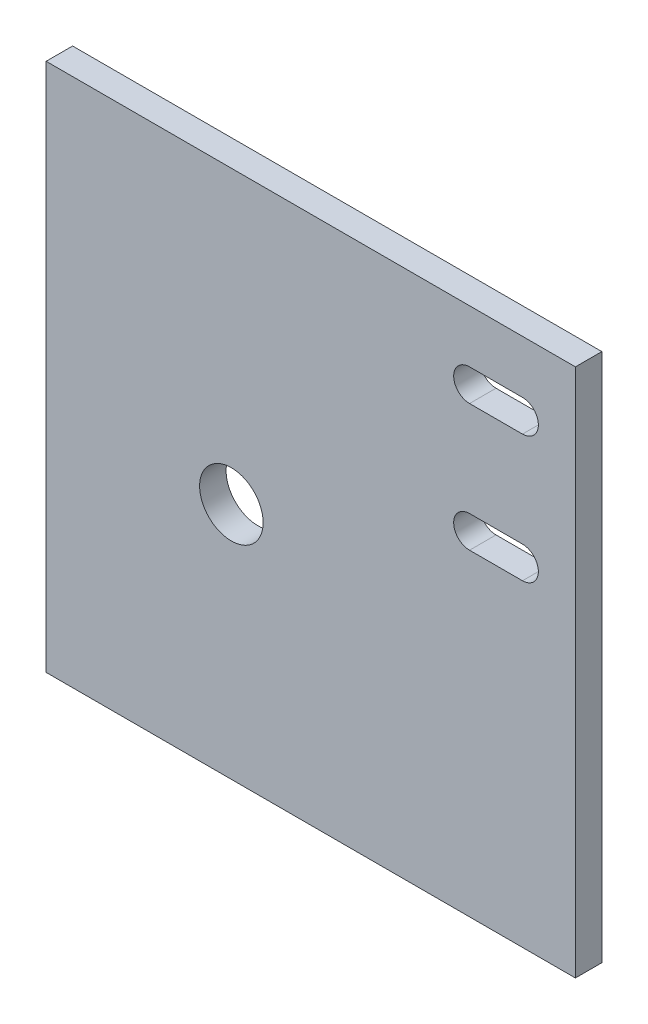
ISO-10303-21;
HEADER;
FILE_DESCRIPTION(('STEP AP214'),'2;1');
FILE_NAME('part.step','',(''),(''),'','','');
FILE_SCHEMA(('AUTOMOTIVE_DESIGN { 1 0 10303 214 1 1 1 1 }'));
ENDSEC;
DATA;
#1=APPLICATION_CONTEXT('core data for automotive mechanical design processes');
#2=APPLICATION_PROTOCOL_DEFINITION('international standard','automotive_design',2000,#1);
#3=PRODUCT_CONTEXT('',#1,'mechanical');
#4=PRODUCT('Part','Part','',(#3));
#5=PRODUCT_RELATED_PRODUCT_CATEGORY('part','',(#4));
#6=PRODUCT_DEFINITION_FORMATION('','',#4);
#7=PRODUCT_DEFINITION_CONTEXT('part definition',#1,'design');
#8=PRODUCT_DEFINITION('design','',#6,#7);
#9=PRODUCT_DEFINITION_SHAPE('','',#8);
#10=(LENGTH_UNIT() NAMED_UNIT(*) SI_UNIT(.MILLI.,.METRE.));
#11=(NAMED_UNIT(*) PLANE_ANGLE_UNIT() SI_UNIT($,.RADIAN.));
#12=(NAMED_UNIT(*) SI_UNIT($,.STERADIAN.) SOLID_ANGLE_UNIT());
#13=UNCERTAINTY_MEASURE_WITH_UNIT(LENGTH_MEASURE(1.E-05),#10,'distance_accuracy_value','');
#14=(GEOMETRIC_REPRESENTATION_CONTEXT(3) GLOBAL_UNCERTAINTY_ASSIGNED_CONTEXT((#13)) GLOBAL_UNIT_ASSIGNED_CONTEXT((#10,
#11,#12)) REPRESENTATION_CONTEXT('',''));
#15=CARTESIAN_POINT('',(0.,0.,0.));
#16=DIRECTION('',(0.,0.,1.));
#17=DIRECTION('',(1.,0.,0.));
#18=AXIS2_PLACEMENT_3D('',#15,#16,#17);
#19=CARTESIAN_POINT('',(0.,0.,5.));
#20=DIRECTION('',(0.,0.,1.));
#21=DIRECTION('',(1.,0.,0.));
#22=AXIS2_PLACEMENT_3D('',#19,#20,#21);
#23=PLANE('',#22);
#24=CARTESIAN_POINT('',(35.,-55.,5.));
#25=DIRECTION('',(0.,0.,1.));
#26=DIRECTION('',(1.,0.,0.));
#27=AXIS2_PLACEMENT_3D('',#24,#25,#26);
#28=CIRCLE('',#27,6.);
#29=CARTESIAN_POINT('',(41.,-55.,5.));
#30=VERTEX_POINT('',#29);
#31=EDGE_CURVE('E348',#30,#30,#28,.T.);
#32=ORIENTED_EDGE('',*,*,#31,.F.);
#33=EDGE_LOOP('',(#32));
#34=FACE_BOUND('',#33,.T.);
#35=DIRECTION('',(0.,-1.,0.));
#36=VECTOR('',#35,1.);
#37=CARTESIAN_POINT('',(0.,0.,5.));
#38=LINE('',#37,#36);
#39=CARTESIAN_POINT('',(0.,0.,5.));
#40=VERTEX_POINT('',#39);
#41=CARTESIAN_POINT('',(0.,-100.,5.));
#42=VERTEX_POINT('',#41);
#43=EDGE_CURVE('E222',#40,#42,#38,.T.);
#44=ORIENTED_EDGE('',*,*,#43,.T.);
#45=DIRECTION('',(1.,0.,0.));
#46=VECTOR('',#45,1.);
#47=CARTESIAN_POINT('',(0.,-100.,5.));
#48=LINE('',#47,#46);
#49=CARTESIAN_POINT('',(100.,-100.,5.));
#50=VERTEX_POINT('',#49);
#51=EDGE_CURVE('E226',#42,#50,#48,.T.);
#52=ORIENTED_EDGE('',*,*,#51,.T.);
#53=DIRECTION('',(0.,1.,0.));
#54=VECTOR('',#53,1.);
#55=CARTESIAN_POINT('',(100.,0.,5.));
#56=LINE('',#55,#54);
#57=CARTESIAN_POINT('',(100.,0.,5.));
#58=VERTEX_POINT('',#57);
#59=EDGE_CURVE('E230',#50,#58,#56,.T.);
#60=ORIENTED_EDGE('',*,*,#59,.T.);
#61=DIRECTION('',(-1.,0.,0.));
#62=VECTOR('',#61,1.);
#63=CARTESIAN_POINT('',(0.,0.,5.));
#64=LINE('',#63,#62);
#65=EDGE_CURVE('E233',#58,#40,#64,.T.);
#66=ORIENTED_EDGE('',*,*,#65,.T.);
#67=EDGE_LOOP('',(#44,#52,#60,#66));
#68=FACE_BOUND('',#67,.T.);
#69=DIRECTION('',(1.,0.,0.));
#70=VECTOR('',#69,1.);
#71=CARTESIAN_POINT('',(80.,-16.,5.));
#72=LINE('',#71,#70);
#73=CARTESIAN_POINT('',(80.,-16.,5.));
#74=VERTEX_POINT('',#73);
#75=CARTESIAN_POINT('',(90.,-16.,5.));
#76=VERTEX_POINT('',#75);
#77=EDGE_CURVE('E182',#74,#76,#72,.T.);
#78=ORIENTED_EDGE('',*,*,#77,.F.);
#79=CARTESIAN_POINT('',(80.,-13.,5.));
#80=DIRECTION('',(0.,0.,1.));
#81=DIRECTION('',(1.,0.,0.));
#82=AXIS2_PLACEMENT_3D('',#79,#80,#81);
#83=CIRCLE('',#82,3.);
#84=CARTESIAN_POINT('',(80.,-10.,5.));
#85=VERTEX_POINT('',#84);
#86=EDGE_CURVE('E179',#85,#74,#83,.T.);
#87=ORIENTED_EDGE('',*,*,#86,.F.);
#88=DIRECTION('',(-1.,0.,0.));
#89=VECTOR('',#88,1.);
#90=CARTESIAN_POINT('',(80.,-10.,5.));
#91=LINE('',#90,#89);
#92=CARTESIAN_POINT('',(90.,-10.,5.));
#93=VERTEX_POINT('',#92);
#94=EDGE_CURVE('E190',#93,#85,#91,.T.);
#95=ORIENTED_EDGE('',*,*,#94,.F.);
#96=CARTESIAN_POINT('',(90.,-13.,5.));
#97=DIRECTION('',(0.,0.,1.));
#98=DIRECTION('',(1.,0.,0.));
#99=AXIS2_PLACEMENT_3D('',#96,#97,#98);
#100=CIRCLE('',#99,3.);
#101=EDGE_CURVE('E186',#76,#93,#100,.T.);
#102=ORIENTED_EDGE('',*,*,#101,.F.);
#103=EDGE_LOOP('',(#78,#87,#95,#102));
#104=FACE_BOUND('',#103,.T.);
#105=DIRECTION('',(1.,0.,0.));
#106=VECTOR('',#105,1.);
#107=CARTESIAN_POINT('',(80.,-40.,5.));
#108=LINE('',#107,#106);
#109=CARTESIAN_POINT('',(80.,-40.,5.));
#110=VERTEX_POINT('',#109);
#111=CARTESIAN_POINT('',(90.,-40.,5.));
#112=VERTEX_POINT('',#111);
#113=EDGE_CURVE('E138',#110,#112,#108,.T.);
#114=ORIENTED_EDGE('',*,*,#113,.F.);
#115=CARTESIAN_POINT('',(80.,-37.,5.));
#116=DIRECTION('',(0.,0.,1.));
#117=DIRECTION('',(1.,0.,0.));
#118=AXIS2_PLACEMENT_3D('',#115,#116,#117);
#119=CIRCLE('',#118,3.);
#120=CARTESIAN_POINT('',(80.,-34.,5.));
#121=VERTEX_POINT('',#120);
#122=EDGE_CURVE('E129',#121,#110,#119,.T.);
#123=ORIENTED_EDGE('',*,*,#122,.F.);
#124=DIRECTION('',(-1.,0.,0.));
#125=VECTOR('',#124,1.);
#126=CARTESIAN_POINT('',(80.,-34.,5.));
#127=LINE('',#126,#125);
#128=CARTESIAN_POINT('',(90.,-34.,5.));
#129=VERTEX_POINT('',#128);
#130=EDGE_CURVE('E155',#129,#121,#127,.T.);
#131=ORIENTED_EDGE('',*,*,#130,.F.);
#132=CARTESIAN_POINT('',(90.,-37.,5.));
#133=DIRECTION('',(0.,0.,1.));
#134=DIRECTION('',(1.,0.,0.));
#135=AXIS2_PLACEMENT_3D('',#132,#133,#134);
#136=CIRCLE('',#135,3.);
#137=EDGE_CURVE('E151',#112,#129,#136,.T.);
#138=ORIENTED_EDGE('',*,*,#137,.F.);
#139=EDGE_LOOP('',(#114,#123,#131,#138));
#140=FACE_BOUND('',#139,.T.);
#141=ADVANCED_FACE('F39',(#34,#68,#104,#140),#23,.T.);
#142=CARTESIAN_POINT('',(0.,0.,0.));
#143=DIRECTION('',(0.,0.,1.));
#144=DIRECTION('',(1.,0.,0.));
#145=AXIS2_PLACEMENT_3D('',#142,#143,#144);
#146=PLANE('',#145);
#147=CARTESIAN_POINT('',(35.,-55.,0.));
#148=DIRECTION('',(0.,0.,1.));
#149=DIRECTION('',(1.,0.,0.));
#150=AXIS2_PLACEMENT_3D('',#147,#148,#149);
#151=CIRCLE('',#150,6.);
#152=CARTESIAN_POINT('',(41.,-55.,0.));
#153=VERTEX_POINT('',#152);
#154=EDGE_CURVE('E163',#153,#153,#151,.T.);
#155=ORIENTED_EDGE('',*,*,#154,.T.);
#156=EDGE_LOOP('',(#155));
#157=FACE_BOUND('',#156,.T.);
#158=CARTESIAN_POINT('',(80.,-13.,0.));
#159=DIRECTION('',(0.,0.,1.));
#160=DIRECTION('',(1.,0.,0.));
#161=AXIS2_PLACEMENT_3D('',#158,#159,#160);
#162=CIRCLE('',#161,3.);
#163=CARTESIAN_POINT('',(80.,-10.,0.));
#164=VERTEX_POINT('',#163);
#165=CARTESIAN_POINT('',(80.,-16.,0.));
#166=VERTEX_POINT('',#165);
#167=EDGE_CURVE('E147',#164,#166,#162,.T.);
#168=ORIENTED_EDGE('',*,*,#167,.T.);
#169=DIRECTION('',(1.,0.,0.));
#170=VECTOR('',#169,1.);
#171=CARTESIAN_POINT('',(80.,-16.,0.));
#172=LINE('',#171,#170);
#173=CARTESIAN_POINT('',(90.,-16.,0.));
#174=VERTEX_POINT('',#173);
#175=EDGE_CURVE('E197',#166,#174,#172,.T.);
#176=ORIENTED_EDGE('',*,*,#175,.T.);
#177=CARTESIAN_POINT('',(90.,-13.,0.));
#178=DIRECTION('',(0.,0.,1.));
#179=DIRECTION('',(1.,0.,0.));
#180=AXIS2_PLACEMENT_3D('',#177,#178,#179);
#181=CIRCLE('',#180,3.);
#182=CARTESIAN_POINT('',(90.,-10.,0.));
#183=VERTEX_POINT('',#182);
#184=EDGE_CURVE('E201',#174,#183,#181,.T.);
#185=ORIENTED_EDGE('',*,*,#184,.T.);
#186=DIRECTION('',(-1.,0.,0.));
#187=VECTOR('',#186,1.);
#188=CARTESIAN_POINT('',(80.,-10.,0.));
#189=LINE('',#188,#187);
#190=EDGE_CURVE('E183',#183,#164,#189,.T.);
#191=ORIENTED_EDGE('',*,*,#190,.T.);
#192=EDGE_LOOP('',(#168,#176,#185,#191));
#193=FACE_BOUND('',#192,.T.);
#194=DIRECTION('',(0.,-1.,0.));
#195=VECTOR('',#194,1.);
#196=CARTESIAN_POINT('',(0.,0.,0.));
#197=LINE('',#196,#195);
#198=CARTESIAN_POINT('',(0.,0.,0.));
#199=VERTEX_POINT('',#198);
#200=CARTESIAN_POINT('',(0.,-100.,0.));
#201=VERTEX_POINT('',#200);
#202=EDGE_CURVE('E221',#199,#201,#197,.T.);
#203=ORIENTED_EDGE('',*,*,#202,.F.);
#204=DIRECTION('',(-1.,0.,0.));
#205=VECTOR('',#204,1.);
#206=CARTESIAN_POINT('',(0.,0.,0.));
#207=LINE('',#206,#205);
#208=CARTESIAN_POINT('',(100.,0.,0.));
#209=VERTEX_POINT('',#208);
#210=EDGE_CURVE('E227',#209,#199,#207,.T.);
#211=ORIENTED_EDGE('',*,*,#210,.F.);
#212=DIRECTION('',(0.,1.,0.));
#213=VECTOR('',#212,1.);
#214=CARTESIAN_POINT('',(100.,0.,0.));
#215=LINE('',#214,#213);
#216=CARTESIAN_POINT('',(100.,-100.,0.));
#217=VERTEX_POINT('',#216);
#218=EDGE_CURVE('E243',#217,#209,#215,.T.);
#219=ORIENTED_EDGE('',*,*,#218,.F.);
#220=DIRECTION('',(1.,0.,0.));
#221=VECTOR('',#220,1.);
#222=CARTESIAN_POINT('',(0.,-100.,0.));
#223=LINE('',#222,#221);
#224=EDGE_CURVE('E240',#201,#217,#223,.T.);
#225=ORIENTED_EDGE('',*,*,#224,.F.);
#226=EDGE_LOOP('',(#203,#211,#219,#225));
#227=FACE_BOUND('',#226,.T.);
#228=CARTESIAN_POINT('',(80.,-37.,0.));
#229=DIRECTION('',(0.,0.,1.));
#230=DIRECTION('',(1.,0.,0.));
#231=AXIS2_PLACEMENT_3D('',#228,#229,#230);
#232=CIRCLE('',#231,3.);
#233=CARTESIAN_POINT('',(80.,-34.,0.));
#234=VERTEX_POINT('',#233);
#235=CARTESIAN_POINT('',(80.,-40.,0.));
#236=VERTEX_POINT('',#235);
#237=EDGE_CURVE('E63',#234,#236,#232,.T.);
#238=ORIENTED_EDGE('',*,*,#237,.T.);
#239=DIRECTION('',(1.,0.,0.));
#240=VECTOR('',#239,1.);
#241=CARTESIAN_POINT('',(80.,-40.,0.));
#242=LINE('',#241,#240);
#243=CARTESIAN_POINT('',(90.,-40.,0.));
#244=VERTEX_POINT('',#243);
#245=EDGE_CURVE('E145',#236,#244,#242,.T.);
#246=ORIENTED_EDGE('',*,*,#245,.T.);
#247=CARTESIAN_POINT('',(90.,-37.,0.));
#248=DIRECTION('',(0.,0.,1.));
#249=DIRECTION('',(1.,0.,0.));
#250=AXIS2_PLACEMENT_3D('',#247,#248,#249);
#251=CIRCLE('',#250,3.);
#252=CARTESIAN_POINT('',(90.,-34.,0.));
#253=VERTEX_POINT('',#252);
#254=EDGE_CURVE('E166',#244,#253,#251,.T.);
#255=ORIENTED_EDGE('',*,*,#254,.T.);
#256=DIRECTION('',(-1.,0.,0.));
#257=VECTOR('',#256,1.);
#258=CARTESIAN_POINT('',(80.,-34.,0.));
#259=LINE('',#258,#257);
#260=EDGE_CURVE('E139',#253,#234,#259,.T.);
#261=ORIENTED_EDGE('',*,*,#260,.T.);
#262=EDGE_LOOP('',(#238,#246,#255,#261));
#263=FACE_BOUND('',#262,.T.);
#264=ADVANCED_FACE('F266',(#157,#193,#227,#263),#146,.F.);
#265=CARTESIAN_POINT('',(0.,0.,5.));
#266=DIRECTION('',(1.,0.,0.));
#267=DIRECTION('',(0.,1.,0.));
#268=AXIS2_PLACEMENT_3D('',#265,#266,#267);
#269=PLANE('',#268);
#270=ORIENTED_EDGE('',*,*,#202,.T.);
#271=DIRECTION('',(0.,0.,-1.));
#272=VECTOR('',#271,1.);
#273=CARTESIAN_POINT('',(0.,-100.,5.));
#274=LINE('',#273,#272);
#275=EDGE_CURVE('E11',#42,#201,#274,.T.);
#276=ORIENTED_EDGE('',*,*,#275,.F.);
#277=ORIENTED_EDGE('',*,*,#43,.F.);
#278=DIRECTION('',(0.,0.,-1.));
#279=VECTOR('',#278,1.);
#280=CARTESIAN_POINT('',(0.,0.,5.));
#281=LINE('',#280,#279);
#282=EDGE_CURVE('E236',#40,#199,#281,.T.);
#283=ORIENTED_EDGE('',*,*,#282,.T.);
#284=EDGE_LOOP('',(#270,#276,#277,#283));
#285=FACE_BOUND('',#284,.T.);
#286=ADVANCED_FACE('F41',(#285),#269,.F.);
#287=CARTESIAN_POINT('',(0.,-100.,5.));
#288=DIRECTION('',(0.,1.,0.));
#289=DIRECTION('',(0.,0.,1.));
#290=AXIS2_PLACEMENT_3D('',#287,#288,#289);
#291=PLANE('',#290);
#292=ORIENTED_EDGE('',*,*,#224,.T.);
#293=DIRECTION('',(0.,0.,-1.));
#294=VECTOR('',#293,1.);
#295=CARTESIAN_POINT('',(100.,-100.,5.));
#296=LINE('',#295,#294);
#297=EDGE_CURVE('E48',#50,#217,#296,.T.);
#298=ORIENTED_EDGE('',*,*,#297,.F.);
#299=ORIENTED_EDGE('',*,*,#51,.F.);
#300=ORIENTED_EDGE('',*,*,#275,.T.);
#301=EDGE_LOOP('',(#292,#298,#299,#300));
#302=FACE_BOUND('',#301,.T.);
#303=ADVANCED_FACE('F277',(#302),#291,.F.);
#304=CARTESIAN_POINT('',(100.,0.,5.));
#305=DIRECTION('',(-1.,0.,0.));
#306=DIRECTION('',(0.,-1.,0.));
#307=AXIS2_PLACEMENT_3D('',#304,#305,#306);
#308=PLANE('',#307);
#309=ORIENTED_EDGE('',*,*,#218,.T.);
#310=DIRECTION('',(0.,0.,-1.));
#311=VECTOR('',#310,1.);
#312=CARTESIAN_POINT('',(100.,0.,5.));
#313=LINE('',#312,#311);
#314=EDGE_CURVE('E251',#58,#209,#313,.T.);
#315=ORIENTED_EDGE('',*,*,#314,.F.);
#316=ORIENTED_EDGE('',*,*,#59,.F.);
#317=ORIENTED_EDGE('',*,*,#297,.T.);
#318=EDGE_LOOP('',(#309,#315,#316,#317));
#319=FACE_BOUND('',#318,.T.);
#320=ADVANCED_FACE('F260',(#319),#308,.F.);
#321=CARTESIAN_POINT('',(0.,0.,5.));
#322=DIRECTION('',(0.,-1.,0.));
#323=DIRECTION('',(0.,0.,-1.));
#324=AXIS2_PLACEMENT_3D('',#321,#322,#323);
#325=PLANE('',#324);
#326=ORIENTED_EDGE('',*,*,#210,.T.);
#327=ORIENTED_EDGE('',*,*,#282,.F.);
#328=ORIENTED_EDGE('',*,*,#65,.F.);
#329=ORIENTED_EDGE('',*,*,#314,.T.);
#330=EDGE_LOOP('',(#326,#327,#328,#329));
#331=FACE_BOUND('',#330,.T.);
#332=ADVANCED_FACE('F270',(#331),#325,.F.);
#333=CARTESIAN_POINT('',(80.,-13.,5.));
#334=DIRECTION('',(0.,0.,-1.));
#335=DIRECTION('',(-1.,0.,0.));
#336=AXIS2_PLACEMENT_3D('',#333,#334,#335);
#337=CYLINDRICAL_SURFACE('',#336,3.);
#338=ORIENTED_EDGE('',*,*,#167,.F.);
#339=DIRECTION('',(0.,0.,-1.));
#340=VECTOR('',#339,1.);
#341=CARTESIAN_POINT('',(80.,-10.,5.));
#342=LINE('',#341,#340);
#343=EDGE_CURVE('E193',#85,#164,#342,.T.);
#344=ORIENTED_EDGE('',*,*,#343,.F.);
#345=ORIENTED_EDGE('',*,*,#86,.T.);
#346=DIRECTION('',(0.,0.,-1.));
#347=VECTOR('',#346,1.);
#348=CARTESIAN_POINT('',(80.,-16.,5.));
#349=LINE('',#348,#347);
#350=EDGE_CURVE('E217',#74,#166,#349,.T.);
#351=ORIENTED_EDGE('',*,*,#350,.T.);
#352=EDGE_LOOP('',(#338,#344,#345,#351));
#353=FACE_BOUND('',#352,.T.);
#354=ADVANCED_FACE('F294',(#353),#337,.F.);
#355=CARTESIAN_POINT('',(80.,-16.,5.));
#356=DIRECTION('',(0.,1.,0.));
#357=DIRECTION('',(0.,0.,1.));
#358=AXIS2_PLACEMENT_3D('',#355,#356,#357);
#359=PLANE('',#358);
#360=ORIENTED_EDGE('',*,*,#175,.F.);
#361=ORIENTED_EDGE('',*,*,#350,.F.);
#362=ORIENTED_EDGE('',*,*,#77,.T.);
#363=DIRECTION('',(0.,0.,-1.));
#364=VECTOR('',#363,1.);
#365=CARTESIAN_POINT('',(90.,-16.,5.));
#366=LINE('',#365,#364);
#367=EDGE_CURVE('E214',#76,#174,#366,.T.);
#368=ORIENTED_EDGE('',*,*,#367,.T.);
#369=EDGE_LOOP('',(#360,#361,#362,#368));
#370=FACE_BOUND('',#369,.T.);
#371=ADVANCED_FACE('F301',(#370),#359,.T.);
#372=CARTESIAN_POINT('',(90.,-13.,5.));
#373=DIRECTION('',(0.,0.,-1.));
#374=DIRECTION('',(-1.,0.,0.));
#375=AXIS2_PLACEMENT_3D('',#372,#373,#374);
#376=CYLINDRICAL_SURFACE('',#375,3.);
#377=ORIENTED_EDGE('',*,*,#184,.F.);
#378=ORIENTED_EDGE('',*,*,#367,.F.);
#379=ORIENTED_EDGE('',*,*,#101,.T.);
#380=DIRECTION('',(0.,0.,-1.));
#381=VECTOR('',#380,1.);
#382=CARTESIAN_POINT('',(90.,-10.,5.));
#383=LINE('',#382,#381);
#384=EDGE_CURVE('E211',#93,#183,#383,.T.);
#385=ORIENTED_EDGE('',*,*,#384,.T.);
#386=EDGE_LOOP('',(#377,#378,#379,#385));
#387=FACE_BOUND('',#386,.T.);
#388=ADVANCED_FACE('F306',(#387),#376,.F.);
#389=CARTESIAN_POINT('',(80.,-10.,5.));
#390=DIRECTION('',(0.,-1.,0.));
#391=DIRECTION('',(0.,0.,-1.));
#392=AXIS2_PLACEMENT_3D('',#389,#390,#391);
#393=PLANE('',#392);
#394=ORIENTED_EDGE('',*,*,#190,.F.);
#395=ORIENTED_EDGE('',*,*,#384,.F.);
#396=ORIENTED_EDGE('',*,*,#94,.T.);
#397=ORIENTED_EDGE('',*,*,#343,.T.);
#398=EDGE_LOOP('',(#394,#395,#396,#397));
#399=FACE_BOUND('',#398,.T.);
#400=ADVANCED_FACE('F314',(#399),#393,.T.);
#401=CARTESIAN_POINT('',(80.,-37.,5.));
#402=DIRECTION('',(0.,0.,-1.));
#403=DIRECTION('',(-1.,0.,0.));
#404=AXIS2_PLACEMENT_3D('',#401,#402,#403);
#405=CYLINDRICAL_SURFACE('',#404,3.);
#406=ORIENTED_EDGE('',*,*,#237,.F.);
#407=DIRECTION('',(0.,0.,-1.));
#408=VECTOR('',#407,1.);
#409=CARTESIAN_POINT('',(80.,-34.,5.));
#410=LINE('',#409,#408);
#411=EDGE_CURVE('E133',#121,#234,#410,.T.);
#412=ORIENTED_EDGE('',*,*,#411,.F.);
#413=ORIENTED_EDGE('',*,*,#122,.T.);
#414=DIRECTION('',(0.,0.,-1.));
#415=VECTOR('',#414,1.);
#416=CARTESIAN_POINT('',(80.,-40.,5.));
#417=LINE('',#416,#415);
#418=EDGE_CURVE('E132',#110,#236,#417,.T.);
#419=ORIENTED_EDGE('',*,*,#418,.T.);
#420=EDGE_LOOP('',(#406,#412,#413,#419));
#421=FACE_BOUND('',#420,.T.);
#422=ADVANCED_FACE('F131',(#421),#405,.F.);
#423=CARTESIAN_POINT('',(80.,-40.,5.));
#424=DIRECTION('',(0.,1.,0.));
#425=DIRECTION('',(-1.,0.,0.));
#426=AXIS2_PLACEMENT_3D('',#423,#424,#425);
#427=PLANE('',#426);
#428=ORIENTED_EDGE('',*,*,#245,.F.);
#429=ORIENTED_EDGE('',*,*,#418,.F.);
#430=ORIENTED_EDGE('',*,*,#113,.T.);
#431=DIRECTION('',(0.,0.,-1.));
#432=VECTOR('',#431,1.);
#433=CARTESIAN_POINT('',(90.,-40.,5.));
#434=LINE('',#433,#432);
#435=EDGE_CURVE('E148',#112,#244,#434,.T.);
#436=ORIENTED_EDGE('',*,*,#435,.T.);
#437=EDGE_LOOP('',(#428,#429,#430,#436));
#438=FACE_BOUND('',#437,.T.);
#439=ADVANCED_FACE('F142',(#438),#427,.T.);
#440=CARTESIAN_POINT('',(90.,-37.,5.));
#441=DIRECTION('',(0.,0.,-1.));
#442=DIRECTION('',(-1.,0.,0.));
#443=AXIS2_PLACEMENT_3D('',#440,#441,#442);
#444=CYLINDRICAL_SURFACE('',#443,3.);
#445=ORIENTED_EDGE('',*,*,#254,.F.);
#446=ORIENTED_EDGE('',*,*,#435,.F.);
#447=ORIENTED_EDGE('',*,*,#137,.T.);
#448=DIRECTION('',(0.,0.,-1.));
#449=VECTOR('',#448,1.);
#450=CARTESIAN_POINT('',(90.,-34.,5.));
#451=LINE('',#450,#449);
#452=EDGE_CURVE('E55',#129,#253,#451,.T.);
#453=ORIENTED_EDGE('',*,*,#452,.T.);
#454=EDGE_LOOP('',(#445,#446,#447,#453));
#455=FACE_BOUND('',#454,.T.);
#456=ADVANCED_FACE('F332',(#455),#444,.F.);
#457=CARTESIAN_POINT('',(80.,-34.,5.));
#458=DIRECTION('',(0.,-1.,0.));
#459=DIRECTION('',(1.,0.,0.));
#460=AXIS2_PLACEMENT_3D('',#457,#458,#459);
#461=PLANE('',#460);
#462=ORIENTED_EDGE('',*,*,#260,.F.);
#463=ORIENTED_EDGE('',*,*,#452,.F.);
#464=ORIENTED_EDGE('',*,*,#130,.T.);
#465=ORIENTED_EDGE('',*,*,#411,.T.);
#466=EDGE_LOOP('',(#462,#463,#464,#465));
#467=FACE_BOUND('',#466,.T.);
#468=ADVANCED_FACE('F335',(#467),#461,.T.);
#469=CARTESIAN_POINT('',(35.,-55.,0.));
#470=DIRECTION('',(0.,0.,1.));
#471=DIRECTION('',(1.,0.,0.));
#472=AXIS2_PLACEMENT_3D('',#469,#470,#471);
#473=CYLINDRICAL_SURFACE('',#472,6.);
#474=ORIENTED_EDGE('',*,*,#154,.F.);
#475=EDGE_LOOP('',(#474));
#476=FACE_BOUND('',#475,.T.);
#477=ORIENTED_EDGE('',*,*,#31,.T.);
#478=EDGE_LOOP('',(#477));
#479=FACE_BOUND('',#478,.T.);
#480=ADVANCED_FACE('F339',(#476,#479),#473,.F.);
#481=CLOSED_SHELL('',(#141,#264,#286,#303,#320,#332,#354,#371,#388,#400,#422,#439,#456,#468,#480));
#482=MANIFOLD_SOLID_BREP('B2',#481);
#483=ADVANCED_BREP_SHAPE_REPRESENTATION('',(#18,#482),#14);
#484=SHAPE_DEFINITION_REPRESENTATION(#9,#483);
ENDSEC;
END-ISO-10303-21;
